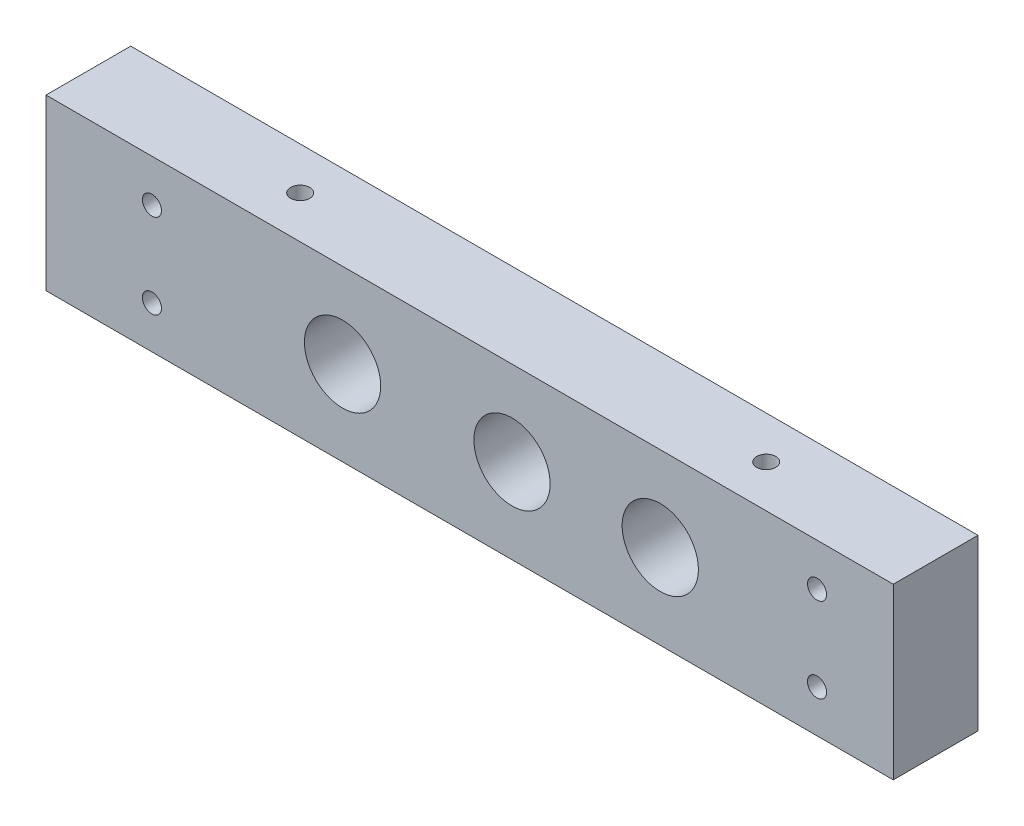
ISO-10303-21;
HEADER;
FILE_DESCRIPTION(('STEP AP214'),'2;1');
FILE_NAME('part.step','',(''),(''),'','','');
FILE_SCHEMA(('AUTOMOTIVE_DESIGN { 1 0 10303 214 1 1 1 1 }'));
ENDSEC;
DATA;
#1=APPLICATION_CONTEXT('core data for automotive mechanical design processes');
#2=APPLICATION_PROTOCOL_DEFINITION('international standard','automotive_design',2000,#1);
#3=PRODUCT_CONTEXT('',#1,'mechanical');
#4=PRODUCT('Part','Part','',(#3));
#5=PRODUCT_RELATED_PRODUCT_CATEGORY('part','',(#4));
#6=PRODUCT_DEFINITION_FORMATION('','',#4);
#7=PRODUCT_DEFINITION_CONTEXT('part definition',#1,'design');
#8=PRODUCT_DEFINITION('design','',#6,#7);
#9=PRODUCT_DEFINITION_SHAPE('','',#8);
#10=(LENGTH_UNIT() NAMED_UNIT(*) SI_UNIT(.MILLI.,.METRE.));
#11=(NAMED_UNIT(*) PLANE_ANGLE_UNIT() SI_UNIT($,.RADIAN.));
#12=(NAMED_UNIT(*) SI_UNIT($,.STERADIAN.) SOLID_ANGLE_UNIT());
#13=UNCERTAINTY_MEASURE_WITH_UNIT(LENGTH_MEASURE(1.E-05),#10,'distance_accuracy_value','');
#14=(GEOMETRIC_REPRESENTATION_CONTEXT(3) GLOBAL_UNCERTAINTY_ASSIGNED_CONTEXT((#13)) GLOBAL_UNIT_ASSIGNED_CONTEXT((#10,
#11,#12)) REPRESENTATION_CONTEXT('',''));
#15=CARTESIAN_POINT('',(0.,0.,0.));
#16=DIRECTION('',(0.,0.,1.));
#17=DIRECTION('',(1.,0.,0.));
#18=AXIS2_PLACEMENT_3D('',#15,#16,#17);
#19=CARTESIAN_POINT('',(0.,-20.,10.));
#20=DIRECTION('',(1.,0.,0.));
#21=DIRECTION('',(0.,0.,-1.));
#22=AXIS2_PLACEMENT_3D('',#19,#20,#21);
#23=PLANE('',#22);
#24=DIRECTION('',(0.,-1.,0.));
#25=VECTOR('',#24,1.);
#26=CARTESIAN_POINT('',(0.,-20.,-10.));
#27=LINE('',#26,#25);
#28=CARTESIAN_POINT('',(0.,20.,-10.));
#29=VERTEX_POINT('',#28);
#30=CARTESIAN_POINT('',(0.,-20.,-10.));
#31=VERTEX_POINT('',#30);
#32=EDGE_CURVE('E117',#29,#31,#27,.T.);
#33=ORIENTED_EDGE('',*,*,#32,.T.);
#34=DIRECTION('',(0.,0.,-1.));
#35=VECTOR('',#34,1.);
#36=CARTESIAN_POINT('',(0.,-20.,10.));
#37=LINE('',#36,#35);
#38=CARTESIAN_POINT('',(0.,-20.,10.));
#39=VERTEX_POINT('',#38);
#40=EDGE_CURVE('E11',#39,#31,#37,.T.);
#41=ORIENTED_EDGE('',*,*,#40,.F.);
#42=DIRECTION('',(0.,-1.,0.));
#43=VECTOR('',#42,1.);
#44=CARTESIAN_POINT('',(0.,-20.,10.));
#45=LINE('',#44,#43);
#46=CARTESIAN_POINT('',(0.,20.,10.));
#47=VERTEX_POINT('',#46);
#48=EDGE_CURVE('E97',#47,#39,#45,.T.);
#49=ORIENTED_EDGE('',*,*,#48,.F.);
#50=DIRECTION('',(0.,0.,-1.));
#51=VECTOR('',#50,1.);
#52=CARTESIAN_POINT('',(0.,20.,10.));
#53=LINE('',#52,#51);
#54=EDGE_CURVE('E115',#47,#29,#53,.T.);
#55=ORIENTED_EDGE('',*,*,#54,.T.);
#56=EDGE_LOOP('',(#33,#41,#49,#55));
#57=FACE_BOUND('',#56,.T.);
#58=ADVANCED_FACE('F50',(#57),#23,.F.);
#59=CARTESIAN_POINT('',(0.,-20.,10.));
#60=DIRECTION('',(0.,1.,0.));
#61=DIRECTION('',(0.,0.,1.));
#62=AXIS2_PLACEMENT_3D('',#59,#60,#61);
#63=PLANE('',#62);
#64=CARTESIAN_POINT('',(50.,-20.,0.));
#65=DIRECTION('',(0.,1.,0.));
#66=DIRECTION('',(0.,0.,1.));
#67=AXIS2_PLACEMENT_3D('',#64,#65,#66);
#68=CIRCLE('',#67,2.25);
#69=CARTESIAN_POINT('',(50.,-20.,2.25));
#70=VERTEX_POINT('',#69);
#71=EDGE_CURVE('E154',#70,#70,#68,.T.);
#72=ORIENTED_EDGE('',*,*,#71,.T.);
#73=EDGE_LOOP('',(#72));
#74=FACE_BOUND('',#73,.T.);
#75=CARTESIAN_POINT('',(160.,-20.,0.));
#76=DIRECTION('',(0.,1.,0.));
#77=DIRECTION('',(0.,0.,1.));
#78=AXIS2_PLACEMENT_3D('',#75,#76,#77);
#79=CIRCLE('',#78,2.25);
#80=CARTESIAN_POINT('',(160.,-20.,2.25));
#81=VERTEX_POINT('',#80);
#82=EDGE_CURVE('E197',#81,#81,#79,.T.);
#83=ORIENTED_EDGE('',*,*,#82,.T.);
#84=EDGE_LOOP('',(#83));
#85=FACE_BOUND('',#84,.T.);
#86=DIRECTION('',(1.,0.,0.));
#87=VECTOR('',#86,1.);
#88=CARTESIAN_POINT('',(0.,-20.,-10.));
#89=LINE('',#88,#87);
#90=CARTESIAN_POINT('',(200.,-20.,-10.));
#91=VERTEX_POINT('',#90);
#92=EDGE_CURVE('E102',#31,#91,#89,.T.);
#93=ORIENTED_EDGE('',*,*,#92,.T.);
#94=DIRECTION('',(0.,0.,-1.));
#95=VECTOR('',#94,1.);
#96=CARTESIAN_POINT('',(200.,-20.,10.));
#97=LINE('',#96,#95);
#98=CARTESIAN_POINT('',(200.,-20.,10.));
#99=VERTEX_POINT('',#98);
#100=EDGE_CURVE('E57',#99,#91,#97,.T.);
#101=ORIENTED_EDGE('',*,*,#100,.F.);
#102=DIRECTION('',(1.,0.,0.));
#103=VECTOR('',#102,1.);
#104=CARTESIAN_POINT('',(0.,-20.,10.));
#105=LINE('',#104,#103);
#106=EDGE_CURVE('E94',#39,#99,#105,.T.);
#107=ORIENTED_EDGE('',*,*,#106,.F.);
#108=ORIENTED_EDGE('',*,*,#40,.T.);
#109=EDGE_LOOP('',(#93,#101,#107,#108));
#110=FACE_BOUND('',#109,.T.);
#111=ADVANCED_FACE('F103',(#74,#85,#110),#63,.F.);
#112=CARTESIAN_POINT('',(200.,-20.,10.));
#113=DIRECTION('',(-1.,0.,0.));
#114=DIRECTION('',(0.,0.,1.));
#115=AXIS2_PLACEMENT_3D('',#112,#113,#114);
#116=PLANE('',#115);
#117=DIRECTION('',(0.,1.,0.));
#118=VECTOR('',#117,1.);
#119=CARTESIAN_POINT('',(200.,-20.,-10.));
#120=LINE('',#119,#118);
#121=CARTESIAN_POINT('',(200.,20.,-10.));
#122=VERTEX_POINT('',#121);
#123=EDGE_CURVE('E81',#91,#122,#120,.T.);
#124=ORIENTED_EDGE('',*,*,#123,.T.);
#125=DIRECTION('',(0.,0.,-1.));
#126=VECTOR('',#125,1.);
#127=CARTESIAN_POINT('',(200.,20.,10.));
#128=LINE('',#127,#126);
#129=CARTESIAN_POINT('',(200.,20.,10.));
#130=VERTEX_POINT('',#129);
#131=EDGE_CURVE('E106',#130,#122,#128,.T.);
#132=ORIENTED_EDGE('',*,*,#131,.F.);
#133=DIRECTION('',(0.,1.,0.));
#134=VECTOR('',#133,1.);
#135=CARTESIAN_POINT('',(200.,-20.,10.));
#136=LINE('',#135,#134);
#137=EDGE_CURVE('E100',#99,#130,#136,.T.);
#138=ORIENTED_EDGE('',*,*,#137,.F.);
#139=ORIENTED_EDGE('',*,*,#100,.T.);
#140=EDGE_LOOP('',(#124,#132,#138,#139));
#141=FACE_BOUND('',#140,.T.);
#142=ADVANCED_FACE('F110',(#141),#116,.F.);
#143=CARTESIAN_POINT('',(0.,20.,10.));
#144=DIRECTION('',(0.,-1.,0.));
#145=DIRECTION('',(0.,0.,-1.));
#146=AXIS2_PLACEMENT_3D('',#143,#144,#145);
#147=PLANE('',#146);
#148=CARTESIAN_POINT('',(50.,20.,0.));
#149=DIRECTION('',(0.,1.,0.));
#150=DIRECTION('',(0.,0.,1.));
#151=AXIS2_PLACEMENT_3D('',#148,#149,#150);
#152=CIRCLE('',#151,2.25);
#153=CARTESIAN_POINT('',(50.,20.,2.25));
#154=VERTEX_POINT('',#153);
#155=EDGE_CURVE('E198',#154,#154,#152,.T.);
#156=ORIENTED_EDGE('',*,*,#155,.F.);
#157=EDGE_LOOP('',(#156));
#158=FACE_BOUND('',#157,.T.);
#159=CARTESIAN_POINT('',(160.,20.,0.));
#160=DIRECTION('',(0.,1.,0.));
#161=DIRECTION('',(0.,0.,1.));
#162=AXIS2_PLACEMENT_3D('',#159,#160,#161);
#163=CIRCLE('',#162,2.25);
#164=CARTESIAN_POINT('',(160.,20.,2.25));
#165=VERTEX_POINT('',#164);
#166=EDGE_CURVE('E192',#165,#165,#163,.T.);
#167=ORIENTED_EDGE('',*,*,#166,.F.);
#168=EDGE_LOOP('',(#167));
#169=FACE_BOUND('',#168,.T.);
#170=DIRECTION('',(-1.,0.,0.));
#171=VECTOR('',#170,1.);
#172=CARTESIAN_POINT('',(0.,20.,-10.));
#173=LINE('',#172,#171);
#174=EDGE_CURVE('E87',#122,#29,#173,.T.);
#175=ORIENTED_EDGE('',*,*,#174,.T.);
#176=ORIENTED_EDGE('',*,*,#54,.F.);
#177=DIRECTION('',(-1.,0.,0.));
#178=VECTOR('',#177,1.);
#179=CARTESIAN_POINT('',(0.,20.,10.));
#180=LINE('',#179,#178);
#181=EDGE_CURVE('E61',#130,#47,#180,.T.);
#182=ORIENTED_EDGE('',*,*,#181,.F.);
#183=ORIENTED_EDGE('',*,*,#131,.T.);
#184=EDGE_LOOP('',(#175,#176,#182,#183));
#185=FACE_BOUND('',#184,.T.);
#186=ADVANCED_FACE('F134',(#158,#169,#185),#147,.F.);
#187=CARTESIAN_POINT('',(0.,0.,10.));
#188=DIRECTION('',(0.,0.,-1.));
#189=DIRECTION('',(-1.,0.,0.));
#190=AXIS2_PLACEMENT_3D('',#187,#188,#189);
#191=PLANE('',#190);
#192=CARTESIAN_POINT('',(182.,10.,10.));
#193=DIRECTION('',(0.,0.,1.));
#194=DIRECTION('',(1.,0.,0.));
#195=AXIS2_PLACEMENT_3D('',#192,#193,#194);
#196=CIRCLE('',#195,2.25);
#197=CARTESIAN_POINT('',(184.25,10.,10.));
#198=VERTEX_POINT('',#197);
#199=EDGE_CURVE('E148',#198,#198,#196,.T.);
#200=ORIENTED_EDGE('',*,*,#199,.F.);
#201=EDGE_LOOP('',(#200));
#202=FACE_BOUND('',#201,.T.);
#203=CARTESIAN_POINT('',(182.,-10.,10.));
#204=DIRECTION('',(0.,0.,1.));
#205=DIRECTION('',(1.,0.,0.));
#206=AXIS2_PLACEMENT_3D('',#203,#204,#205);
#207=CIRCLE('',#206,2.25);
#208=CARTESIAN_POINT('',(184.25,-10.,10.));
#209=VERTEX_POINT('',#208);
#210=EDGE_CURVE('E156',#209,#209,#207,.T.);
#211=ORIENTED_EDGE('',*,*,#210,.F.);
#212=EDGE_LOOP('',(#211));
#213=FACE_BOUND('',#212,.T.);
#214=CARTESIAN_POINT('',(25.,10.,10.));
#215=DIRECTION('',(0.,0.,1.));
#216=DIRECTION('',(1.,0.,0.));
#217=AXIS2_PLACEMENT_3D('',#214,#215,#216);
#218=CIRCLE('',#217,2.25);
#219=CARTESIAN_POINT('',(27.25,10.,10.));
#220=VERTEX_POINT('',#219);
#221=EDGE_CURVE('E162',#220,#220,#218,.T.);
#222=ORIENTED_EDGE('',*,*,#221,.F.);
#223=EDGE_LOOP('',(#222));
#224=FACE_BOUND('',#223,.T.);
#225=CARTESIAN_POINT('',(25.,-10.,10.));
#226=DIRECTION('',(0.,0.,1.));
#227=DIRECTION('',(1.,0.,0.));
#228=AXIS2_PLACEMENT_3D('',#225,#226,#227);
#229=CIRCLE('',#228,2.25);
#230=CARTESIAN_POINT('',(27.25,-10.,10.));
#231=VERTEX_POINT('',#230);
#232=EDGE_CURVE('E172',#231,#231,#229,.T.);
#233=ORIENTED_EDGE('',*,*,#232,.F.);
#234=EDGE_LOOP('',(#233));
#235=FACE_BOUND('',#234,.T.);
#236=CARTESIAN_POINT('',(145.,0.,10.));
#237=DIRECTION('',(0.,0.,1.));
#238=DIRECTION('',(1.,0.,0.));
#239=AXIS2_PLACEMENT_3D('',#236,#237,#238);
#240=CIRCLE('',#239,9.00000000000001);
#241=CARTESIAN_POINT('',(154.,0.,10.));
#242=VERTEX_POINT('',#241);
#243=EDGE_CURVE('E178',#242,#242,#240,.T.);
#244=ORIENTED_EDGE('',*,*,#243,.F.);
#245=EDGE_LOOP('',(#244));
#246=FACE_BOUND('',#245,.T.);
#247=CARTESIAN_POINT('',(110.,0.,10.));
#248=DIRECTION('',(0.,0.,1.));
#249=DIRECTION('',(1.,0.,0.));
#250=AXIS2_PLACEMENT_3D('',#247,#248,#249);
#251=CIRCLE('',#250,8.99999999999999);
#252=CARTESIAN_POINT('',(119.,0.,10.));
#253=VERTEX_POINT('',#252);
#254=EDGE_CURVE('E144',#253,#253,#251,.T.);
#255=ORIENTED_EDGE('',*,*,#254,.F.);
#256=EDGE_LOOP('',(#255));
#257=FACE_BOUND('',#256,.T.);
#258=CARTESIAN_POINT('',(70.,0.,10.));
#259=DIRECTION('',(0.,0.,1.));
#260=DIRECTION('',(1.,0.,0.));
#261=AXIS2_PLACEMENT_3D('',#258,#259,#260);
#262=CIRCLE('',#261,8.99999999999999);
#263=CARTESIAN_POINT('',(79.,0.,10.));
#264=VERTEX_POINT('',#263);
#265=EDGE_CURVE('E142',#264,#264,#262,.T.);
#266=ORIENTED_EDGE('',*,*,#265,.F.);
#267=EDGE_LOOP('',(#266));
#268=FACE_BOUND('',#267,.T.);
#269=ORIENTED_EDGE('',*,*,#48,.T.);
#270=ORIENTED_EDGE('',*,*,#106,.T.);
#271=ORIENTED_EDGE('',*,*,#137,.T.);
#272=ORIENTED_EDGE('',*,*,#181,.T.);
#273=EDGE_LOOP('',(#269,#270,#271,#272));
#274=FACE_BOUND('',#273,.T.);
#275=ADVANCED_FACE('F92',(#202,#213,#224,#235,#246,#257,#268,#274),#191,.F.);
#276=CARTESIAN_POINT('',(0.,0.,-10.));
#277=DIRECTION('',(0.,0.,-1.));
#278=DIRECTION('',(-1.,0.,0.));
#279=AXIS2_PLACEMENT_3D('',#276,#277,#278);
#280=PLANE('',#279);
#281=CARTESIAN_POINT('',(182.,10.,-10.));
#282=DIRECTION('',(0.,0.,1.));
#283=DIRECTION('',(1.,0.,0.));
#284=AXIS2_PLACEMENT_3D('',#281,#282,#283);
#285=CIRCLE('',#284,2.25);
#286=CARTESIAN_POINT('',(184.25,10.,-10.));
#287=VERTEX_POINT('',#286);
#288=EDGE_CURVE('E151',#287,#287,#285,.T.);
#289=ORIENTED_EDGE('',*,*,#288,.T.);
#290=EDGE_LOOP('',(#289));
#291=FACE_BOUND('',#290,.T.);
#292=CARTESIAN_POINT('',(182.,-10.,-10.));
#293=DIRECTION('',(0.,0.,1.));
#294=DIRECTION('',(1.,0.,0.));
#295=AXIS2_PLACEMENT_3D('',#292,#293,#294);
#296=CIRCLE('',#295,2.25);
#297=CARTESIAN_POINT('',(184.25,-10.,-10.));
#298=VERTEX_POINT('',#297);
#299=EDGE_CURVE('E147',#298,#298,#296,.T.);
#300=ORIENTED_EDGE('',*,*,#299,.T.);
#301=EDGE_LOOP('',(#300));
#302=FACE_BOUND('',#301,.T.);
#303=CARTESIAN_POINT('',(25.,10.,-10.));
#304=DIRECTION('',(0.,0.,1.));
#305=DIRECTION('',(1.,0.,0.));
#306=AXIS2_PLACEMENT_3D('',#303,#304,#305);
#307=CIRCLE('',#306,2.25);
#308=CARTESIAN_POINT('',(27.25,10.,-10.));
#309=VERTEX_POINT('',#308);
#310=EDGE_CURVE('E157',#309,#309,#307,.T.);
#311=ORIENTED_EDGE('',*,*,#310,.T.);
#312=EDGE_LOOP('',(#311));
#313=FACE_BOUND('',#312,.T.);
#314=CARTESIAN_POINT('',(25.,-10.,-10.));
#315=DIRECTION('',(0.,0.,1.));
#316=DIRECTION('',(1.,0.,0.));
#317=AXIS2_PLACEMENT_3D('',#314,#315,#316);
#318=CIRCLE('',#317,2.25);
#319=CARTESIAN_POINT('',(27.25,-10.,-10.));
#320=VERTEX_POINT('',#319);
#321=EDGE_CURVE('E170',#320,#320,#318,.T.);
#322=ORIENTED_EDGE('',*,*,#321,.T.);
#323=EDGE_LOOP('',(#322));
#324=FACE_BOUND('',#323,.T.);
#325=CARTESIAN_POINT('',(145.,0.,-10.));
#326=DIRECTION('',(0.,0.,1.));
#327=DIRECTION('',(1.,0.,0.));
#328=AXIS2_PLACEMENT_3D('',#325,#326,#327);
#329=CIRCLE('',#328,9.00000000000001);
#330=CARTESIAN_POINT('',(154.,0.,-10.));
#331=VERTEX_POINT('',#330);
#332=EDGE_CURVE('E173',#331,#331,#329,.T.);
#333=ORIENTED_EDGE('',*,*,#332,.T.);
#334=EDGE_LOOP('',(#333));
#335=FACE_BOUND('',#334,.T.);
#336=CARTESIAN_POINT('',(110.,0.,-10.));
#337=DIRECTION('',(0.,0.,1.));
#338=DIRECTION('',(1.,0.,0.));
#339=AXIS2_PLACEMENT_3D('',#336,#337,#338);
#340=CIRCLE('',#339,8.99999999999999);
#341=CARTESIAN_POINT('',(119.,0.,-10.));
#342=VERTEX_POINT('',#341);
#343=EDGE_CURVE('E181',#342,#342,#340,.T.);
#344=ORIENTED_EDGE('',*,*,#343,.T.);
#345=EDGE_LOOP('',(#344));
#346=FACE_BOUND('',#345,.T.);
#347=CARTESIAN_POINT('',(70.,0.,-10.));
#348=DIRECTION('',(0.,0.,1.));
#349=DIRECTION('',(1.,0.,0.));
#350=AXIS2_PLACEMENT_3D('',#347,#348,#349);
#351=CIRCLE('',#350,8.99999999999999);
#352=CARTESIAN_POINT('',(79.,0.,-10.));
#353=VERTEX_POINT('',#352);
#354=EDGE_CURVE('E118',#353,#353,#351,.T.);
#355=ORIENTED_EDGE('',*,*,#354,.T.);
#356=EDGE_LOOP('',(#355));
#357=FACE_BOUND('',#356,.T.);
#358=ORIENTED_EDGE('',*,*,#32,.F.);
#359=ORIENTED_EDGE('',*,*,#174,.F.);
#360=ORIENTED_EDGE('',*,*,#123,.F.);
#361=ORIENTED_EDGE('',*,*,#92,.F.);
#362=EDGE_LOOP('',(#358,#359,#360,#361));
#363=FACE_BOUND('',#362,.T.);
#364=ADVANCED_FACE('F133',(#291,#302,#313,#324,#335,#346,#357,#363),#280,.T.);
#365=CARTESIAN_POINT('',(70.,0.,-10.));
#366=DIRECTION('',(0.,0.,1.));
#367=DIRECTION('',(1.,0.,0.));
#368=AXIS2_PLACEMENT_3D('',#365,#366,#367);
#369=CYLINDRICAL_SURFACE('',#368,8.99999999999999);
#370=ORIENTED_EDGE('',*,*,#354,.F.);
#371=EDGE_LOOP('',(#370));
#372=FACE_BOUND('',#371,.T.);
#373=ORIENTED_EDGE('',*,*,#265,.T.);
#374=EDGE_LOOP('',(#373));
#375=FACE_BOUND('',#374,.T.);
#376=ADVANCED_FACE('F242',(#372,#375),#369,.F.);
#377=CARTESIAN_POINT('',(110.,0.,-10.));
#378=DIRECTION('',(0.,0.,1.));
#379=DIRECTION('',(1.,0.,0.));
#380=AXIS2_PLACEMENT_3D('',#377,#378,#379);
#381=CYLINDRICAL_SURFACE('',#380,8.99999999999999);
#382=ORIENTED_EDGE('',*,*,#343,.F.);
#383=EDGE_LOOP('',(#382));
#384=FACE_BOUND('',#383,.T.);
#385=ORIENTED_EDGE('',*,*,#254,.T.);
#386=EDGE_LOOP('',(#385));
#387=FACE_BOUND('',#386,.T.);
#388=ADVANCED_FACE('F247',(#384,#387),#381,.F.);
#389=CARTESIAN_POINT('',(145.,0.,-10.));
#390=DIRECTION('',(0.,0.,1.));
#391=DIRECTION('',(1.,0.,0.));
#392=AXIS2_PLACEMENT_3D('',#389,#390,#391);
#393=CYLINDRICAL_SURFACE('',#392,9.00000000000001);
#394=ORIENTED_EDGE('',*,*,#332,.F.);
#395=EDGE_LOOP('',(#394));
#396=FACE_BOUND('',#395,.T.);
#397=ORIENTED_EDGE('',*,*,#243,.T.);
#398=EDGE_LOOP('',(#397));
#399=FACE_BOUND('',#398,.T.);
#400=ADVANCED_FACE('F257',(#396,#399),#393,.F.);
#401=CARTESIAN_POINT('',(25.,-10.,-10.));
#402=DIRECTION('',(0.,0.,1.));
#403=DIRECTION('',(1.,0.,0.));
#404=AXIS2_PLACEMENT_3D('',#401,#402,#403);
#405=CYLINDRICAL_SURFACE('',#404,2.25);
#406=ORIENTED_EDGE('',*,*,#321,.F.);
#407=EDGE_LOOP('',(#406));
#408=FACE_BOUND('',#407,.T.);
#409=ORIENTED_EDGE('',*,*,#232,.T.);
#410=EDGE_LOOP('',(#409));
#411=FACE_BOUND('',#410,.T.);
#412=ADVANCED_FACE('F258',(#408,#411),#405,.F.);
#413=CARTESIAN_POINT('',(25.,10.,-10.));
#414=DIRECTION('',(0.,0.,1.));
#415=DIRECTION('',(1.,0.,0.));
#416=AXIS2_PLACEMENT_3D('',#413,#414,#415);
#417=CYLINDRICAL_SURFACE('',#416,2.25);
#418=ORIENTED_EDGE('',*,*,#310,.F.);
#419=EDGE_LOOP('',(#418));
#420=FACE_BOUND('',#419,.T.);
#421=ORIENTED_EDGE('',*,*,#221,.T.);
#422=EDGE_LOOP('',(#421));
#423=FACE_BOUND('',#422,.T.);
#424=ADVANCED_FACE('F252',(#420,#423),#417,.F.);
#425=CARTESIAN_POINT('',(182.,-10.,-10.));
#426=DIRECTION('',(0.,0.,1.));
#427=DIRECTION('',(1.,0.,0.));
#428=AXIS2_PLACEMENT_3D('',#425,#426,#427);
#429=CYLINDRICAL_SURFACE('',#428,2.25);
#430=ORIENTED_EDGE('',*,*,#299,.F.);
#431=EDGE_LOOP('',(#430));
#432=FACE_BOUND('',#431,.T.);
#433=ORIENTED_EDGE('',*,*,#210,.T.);
#434=EDGE_LOOP('',(#433));
#435=FACE_BOUND('',#434,.T.);
#436=ADVANCED_FACE('F223',(#432,#435),#429,.F.);
#437=CARTESIAN_POINT('',(182.,10.,-10.));
#438=DIRECTION('',(0.,0.,1.));
#439=DIRECTION('',(1.,0.,0.));
#440=AXIS2_PLACEMENT_3D('',#437,#438,#439);
#441=CYLINDRICAL_SURFACE('',#440,2.25);
#442=ORIENTED_EDGE('',*,*,#288,.F.);
#443=EDGE_LOOP('',(#442));
#444=FACE_BOUND('',#443,.T.);
#445=ORIENTED_EDGE('',*,*,#199,.T.);
#446=EDGE_LOOP('',(#445));
#447=FACE_BOUND('',#446,.T.);
#448=ADVANCED_FACE('F220',(#444,#447),#441,.F.);
#449=CARTESIAN_POINT('',(160.,-20.,0.));
#450=DIRECTION('',(0.,1.,0.));
#451=DIRECTION('',(0.,0.,1.));
#452=AXIS2_PLACEMENT_3D('',#449,#450,#451);
#453=CYLINDRICAL_SURFACE('',#452,2.25);
#454=ORIENTED_EDGE('',*,*,#82,.F.);
#455=EDGE_LOOP('',(#454));
#456=FACE_BOUND('',#455,.T.);
#457=ORIENTED_EDGE('',*,*,#166,.T.);
#458=EDGE_LOOP('',(#457));
#459=FACE_BOUND('',#458,.T.);
#460=ADVANCED_FACE('F214',(#456,#459),#453,.F.);
#461=CARTESIAN_POINT('',(50.,-20.,0.));
#462=DIRECTION('',(0.,1.,0.));
#463=DIRECTION('',(0.,0.,1.));
#464=AXIS2_PLACEMENT_3D('',#461,#462,#463);
#465=CYLINDRICAL_SURFACE('',#464,2.25);
#466=ORIENTED_EDGE('',*,*,#71,.F.);
#467=EDGE_LOOP('',(#466));
#468=FACE_BOUND('',#467,.T.);
#469=ORIENTED_EDGE('',*,*,#155,.T.);
#470=EDGE_LOOP('',(#469));
#471=FACE_BOUND('',#470,.T.);
#472=ADVANCED_FACE('F208',(#468,#471),#465,.F.);
#473=CLOSED_SHELL('',(#58,#111,#142,#186,#275,#364,#376,#388,#400,#412,#424,#436,#448,#460,#472));
#474=MANIFOLD_SOLID_BREP('B2',#473);
#475=ADVANCED_BREP_SHAPE_REPRESENTATION('',(#18,#474),#14);
#476=SHAPE_DEFINITION_REPRESENTATION(#9,#475);
ENDSEC;
END-ISO-10303-21;
